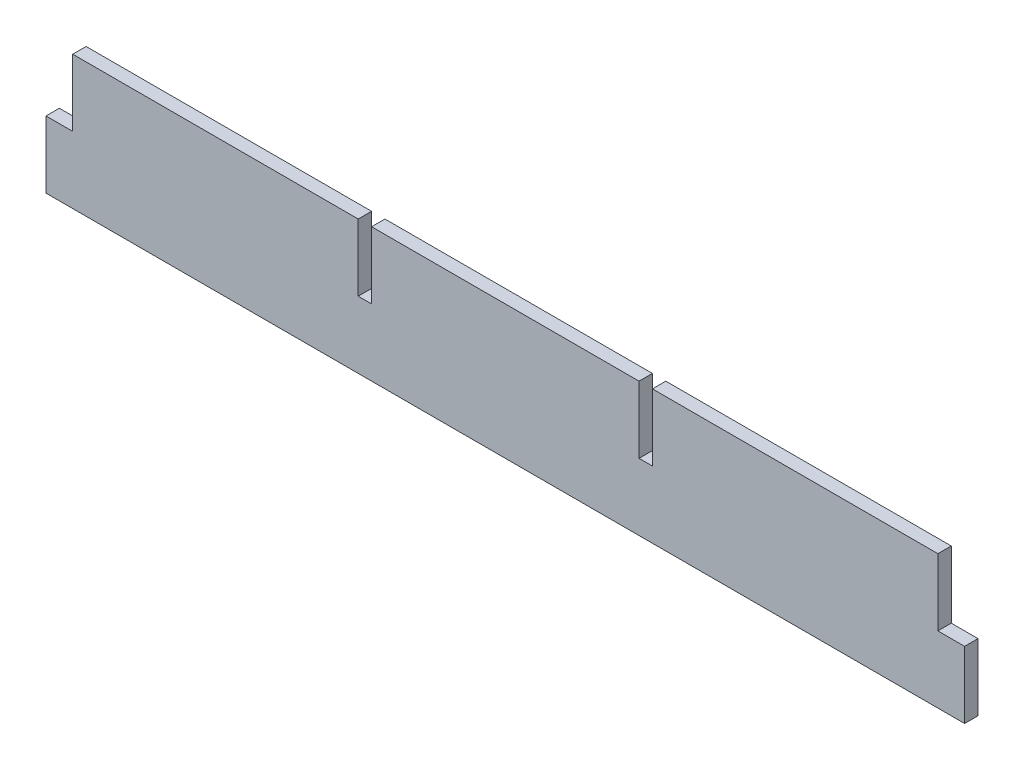
ISO-10303-21;
HEADER;
FILE_DESCRIPTION(('STEP AP214'),'2;1');
FILE_NAME('part.step','',(''),(''),'','','');
FILE_SCHEMA(('AUTOMOTIVE_DESIGN { 1 0 10303 214 1 1 1 1 }'));
ENDSEC;
DATA;
#1=APPLICATION_CONTEXT('core data for automotive mechanical design processes');
#2=APPLICATION_PROTOCOL_DEFINITION('international standard','automotive_design',2000,#1);
#3=PRODUCT_CONTEXT('',#1,'mechanical');
#4=PRODUCT('Part','Part','',(#3));
#5=PRODUCT_RELATED_PRODUCT_CATEGORY('part','',(#4));
#6=PRODUCT_DEFINITION_FORMATION('','',#4);
#7=PRODUCT_DEFINITION_CONTEXT('part definition',#1,'design');
#8=PRODUCT_DEFINITION('design','',#6,#7);
#9=PRODUCT_DEFINITION_SHAPE('','',#8);
#10=(LENGTH_UNIT() NAMED_UNIT(*) SI_UNIT(.MILLI.,.METRE.));
#11=(NAMED_UNIT(*) PLANE_ANGLE_UNIT() SI_UNIT($,.RADIAN.));
#12=(NAMED_UNIT(*) SI_UNIT($,.STERADIAN.) SOLID_ANGLE_UNIT());
#13=UNCERTAINTY_MEASURE_WITH_UNIT(LENGTH_MEASURE(1.E-05),#10,'distance_accuracy_value','');
#14=(GEOMETRIC_REPRESENTATION_CONTEXT(3) GLOBAL_UNCERTAINTY_ASSIGNED_CONTEXT((#13)) GLOBAL_UNIT_ASSIGNED_CONTEXT((#10,
#11,#12)) REPRESENTATION_CONTEXT('',''));
#15=CARTESIAN_POINT('',(0.,0.,0.));
#16=DIRECTION('',(0.,0.,1.));
#17=DIRECTION('',(1.,0.,0.));
#18=AXIS2_PLACEMENT_3D('',#15,#16,#17);
#19=CARTESIAN_POINT('',(323.475,0.,10.));
#20=DIRECTION('',(1.,0.,0.));
#21=DIRECTION('',(0.,0.,-1.));
#22=AXIS2_PLACEMENT_3D('',#19,#20,#21);
#23=PLANE('',#22);
#24=DIRECTION('',(0.,-1.,0.));
#25=VECTOR('',#24,1.);
#26=CARTESIAN_POINT('',(323.475,0.,0.));
#27=LINE('',#26,#25);
#28=CARTESIAN_POINT('',(323.475,-1.00613961606655E-13,0.));
#29=VERTEX_POINT('',#28);
#30=CARTESIAN_POINT('',(323.475,-50.0000000000001,0.));
#31=VERTEX_POINT('',#30);
#32=EDGE_CURVE('E328',#29,#31,#27,.T.);
#33=ORIENTED_EDGE('',*,*,#32,.F.);
#34=DIRECTION('',(0.,0.,-1.));
#35=VECTOR('',#34,1.);
#36=CARTESIAN_POINT('',(323.475,-1.00613961606655E-13,10.));
#37=LINE('',#36,#35);
#38=CARTESIAN_POINT('',(323.475,-1.00613961606655E-13,10.));
#39=VERTEX_POINT('',#38);
#40=EDGE_CURVE('E352',#39,#29,#37,.T.);
#41=ORIENTED_EDGE('',*,*,#40,.F.);
#42=DIRECTION('',(0.,-1.,0.));
#43=VECTOR('',#42,1.);
#44=CARTESIAN_POINT('',(323.475,0.,10.));
#45=LINE('',#44,#43);
#46=CARTESIAN_POINT('',(323.475,-50.0000000000001,10.));
#47=VERTEX_POINT('',#46);
#48=EDGE_CURVE('E439',#39,#47,#45,.T.);
#49=ORIENTED_EDGE('',*,*,#48,.T.);
#50=DIRECTION('',(0.,0.,-1.));
#51=VECTOR('',#50,1.);
#52=CARTESIAN_POINT('',(323.475,-50.0000000000001,10.));
#53=LINE('',#52,#51);
#54=EDGE_CURVE('E355',#47,#31,#53,.T.);
#55=ORIENTED_EDGE('',*,*,#54,.T.);
#56=EDGE_LOOP('',(#33,#41,#49,#55));
#57=FACE_BOUND('',#56,.T.);
#58=ADVANCED_FACE('F139',(#57),#23,.T.);
#59=CARTESIAN_POINT('',(0.,0.,0.));
#60=DIRECTION('',(0.,0.,1.));
#61=DIRECTION('',(1.,0.,0.));
#62=AXIS2_PLACEMENT_3D('',#59,#60,#61);
#63=PLANE('',#62);
#64=DIRECTION('',(1.,0.,0.));
#65=VECTOR('',#64,1.);
#66=CARTESIAN_POINT('',(0.,1.11022302462515E-13,0.));
#67=LINE('',#66,#65);
#68=CARTESIAN_POINT('',(-100.,0.,0.));
#69=VERTEX_POINT('',#68);
#70=CARTESIAN_POINT('',(100.,2.22044604925032E-13,0.));
#71=VERTEX_POINT('',#70);
#72=EDGE_CURVE('E287',#69,#71,#67,.T.);
#73=ORIENTED_EDGE('',*,*,#72,.T.);
#74=DIRECTION('',(0.,-1.,0.));
#75=VECTOR('',#74,1.);
#76=CARTESIAN_POINT('',(100.,2.22044604925032E-13,0.));
#77=LINE('',#76,#75);
#78=CARTESIAN_POINT('',(100.,-49.9999999999997,0.));
#79=VERTEX_POINT('',#78);
#80=EDGE_CURVE('E341',#71,#79,#77,.T.);
#81=ORIENTED_EDGE('',*,*,#80,.T.);
#82=DIRECTION('',(-1.,0.,0.));
#83=VECTOR('',#82,1.);
#84=CARTESIAN_POINT('',(1.38777878078145E-13,-50.,0.));
#85=LINE('',#84,#83);
#86=CARTESIAN_POINT('',(110.,-49.9999999999997,0.));
#87=VERTEX_POINT('',#86);
#88=EDGE_CURVE('E338',#87,#79,#85,.T.);
#89=ORIENTED_EDGE('',*,*,#88,.F.);
#90=DIRECTION('',(0.,-1.,0.));
#91=VECTOR('',#90,1.);
#92=CARTESIAN_POINT('',(110.,2.74780198594727E-13,0.));
#93=LINE('',#92,#91);
#94=CARTESIAN_POINT('',(110.,2.44249061447068E-13,0.));
#95=VERTEX_POINT('',#94);
#96=EDGE_CURVE('E273',#95,#87,#93,.T.);
#97=ORIENTED_EDGE('',*,*,#96,.F.);
#98=DIRECTION('',(1.,0.,0.));
#99=VECTOR('',#98,1.);
#100=CARTESIAN_POINT('',(0.,4.21951058497102E-13,0.));
#101=LINE('',#100,#99);
#102=EDGE_CURVE('E332',#95,#29,#101,.T.);
#103=ORIENTED_EDGE('',*,*,#102,.T.);
#104=ORIENTED_EDGE('',*,*,#32,.T.);
#105=DIRECTION('',(1.,0.,0.));
#106=VECTOR('',#105,1.);
#107=CARTESIAN_POINT('',(0.,-50.0000000000001,0.));
#108=LINE('',#107,#106);
#109=CARTESIAN_POINT('',(343.475,-50.0000000000001,0.));
#110=VERTEX_POINT('',#109);
#111=EDGE_CURVE('E324',#31,#110,#108,.T.);
#112=ORIENTED_EDGE('',*,*,#111,.T.);
#113=DIRECTION('',(0.,-1.,0.));
#114=VECTOR('',#113,1.);
#115=CARTESIAN_POINT('',(343.475,-3.81333853383126E-13,0.));
#116=LINE('',#115,#114);
#117=CARTESIAN_POINT('',(343.475,-100.,0.));
#118=VERTEX_POINT('',#117);
#119=EDGE_CURVE('E320',#110,#118,#116,.T.);
#120=ORIENTED_EDGE('',*,*,#119,.T.);
#121=DIRECTION('',(-1.,0.,0.));
#122=VECTOR('',#121,1.);
#123=CARTESIAN_POINT('',(0.,-100.,0.));
#124=LINE('',#123,#122);
#125=CARTESIAN_POINT('',(-343.475,-100.,0.));
#126=VERTEX_POINT('',#125);
#127=EDGE_CURVE('E316',#118,#126,#124,.T.);
#128=ORIENTED_EDGE('',*,*,#127,.T.);
#129=DIRECTION('',(0.,-1.,0.));
#130=VECTOR('',#129,1.);
#131=CARTESIAN_POINT('',(-343.475,0.,0.));
#132=LINE('',#131,#130);
#133=CARTESIAN_POINT('',(-343.475,-50.0000000000002,0.));
#134=VERTEX_POINT('',#133);
#135=EDGE_CURVE('E312',#134,#126,#132,.T.);
#136=ORIENTED_EDGE('',*,*,#135,.F.);
#137=DIRECTION('',(-1.,0.,0.));
#138=VECTOR('',#137,1.);
#139=CARTESIAN_POINT('',(6.24500451351599E-13,-49.9999999999959,0.));
#140=LINE('',#139,#138);
#141=CARTESIAN_POINT('',(-323.475,-50.,0.));
#142=VERTEX_POINT('',#141);
#143=EDGE_CURVE('E309',#142,#134,#140,.T.);
#144=ORIENTED_EDGE('',*,*,#143,.F.);
#145=DIRECTION('',(0.,-1.,0.));
#146=VECTOR('',#145,1.);
#147=CARTESIAN_POINT('',(-323.475,0.,0.));
#148=LINE('',#147,#146);
#149=CARTESIAN_POINT('',(-323.475,0.,0.));
#150=VERTEX_POINT('',#149);
#151=EDGE_CURVE('E306',#150,#142,#148,.T.);
#152=ORIENTED_EDGE('',*,*,#151,.F.);
#153=DIRECTION('',(1.,0.,0.));
#154=VECTOR('',#153,1.);
#155=CARTESIAN_POINT('',(0.,0.,0.));
#156=LINE('',#155,#154);
#157=CARTESIAN_POINT('',(-110.,0.,0.));
#158=VERTEX_POINT('',#157);
#159=EDGE_CURVE('E302',#150,#158,#156,.T.);
#160=ORIENTED_EDGE('',*,*,#159,.T.);
#161=DIRECTION('',(0.,-1.,0.));
#162=VECTOR('',#161,1.);
#163=CARTESIAN_POINT('',(-110.,0.,0.));
#164=LINE('',#163,#162);
#165=CARTESIAN_POINT('',(-110.,-50.,0.));
#166=VERTEX_POINT('',#165);
#167=EDGE_CURVE('E298',#158,#166,#164,.T.);
#168=ORIENTED_EDGE('',*,*,#167,.T.);
#169=DIRECTION('',(1.,0.,0.));
#170=VECTOR('',#169,1.);
#171=CARTESIAN_POINT('',(0.,-50.,0.));
#172=LINE('',#171,#170);
#173=CARTESIAN_POINT('',(-100.,-50.,0.));
#174=VERTEX_POINT('',#173);
#175=EDGE_CURVE('E294',#166,#174,#172,.T.);
#176=ORIENTED_EDGE('',*,*,#175,.T.);
#177=DIRECTION('',(0.,-1.,0.));
#178=VECTOR('',#177,1.);
#179=CARTESIAN_POINT('',(-100.,0.,0.));
#180=LINE('',#179,#178);
#181=EDGE_CURVE('E290',#69,#174,#180,.T.);
#182=ORIENTED_EDGE('',*,*,#181,.F.);
#183=EDGE_LOOP('',(#73,#81,#89,#97,#103,#104,#112,#120,#128,#136,#144,#152,#160,#168,#176,#182));
#184=FACE_BOUND('',#183,.T.);
#185=ADVANCED_FACE('F395',(#184),#63,.F.);
#186=CARTESIAN_POINT('',(0.,-50.0000000000001,10.));
#187=DIRECTION('',(0.,1.,0.));
#188=DIRECTION('',(0.,0.,1.));
#189=AXIS2_PLACEMENT_3D('',#186,#187,#188);
#190=PLANE('',#189);
#191=ORIENTED_EDGE('',*,*,#111,.F.);
#192=ORIENTED_EDGE('',*,*,#54,.F.);
#193=DIRECTION('',(1.,0.,0.));
#194=VECTOR('',#193,1.);
#195=CARTESIAN_POINT('',(0.,-50.0000000000001,10.));
#196=LINE('',#195,#194);
#197=CARTESIAN_POINT('',(343.475,-50.0000000000001,10.));
#198=VERTEX_POINT('',#197);
#199=EDGE_CURVE('E435',#47,#198,#196,.T.);
#200=ORIENTED_EDGE('',*,*,#199,.T.);
#201=DIRECTION('',(0.,0.,-1.));
#202=VECTOR('',#201,1.);
#203=CARTESIAN_POINT('',(343.475,-50.0000000000001,10.));
#204=LINE('',#203,#202);
#205=EDGE_CURVE('E358',#198,#110,#204,.T.);
#206=ORIENTED_EDGE('',*,*,#205,.T.);
#207=EDGE_LOOP('',(#191,#192,#200,#206));
#208=FACE_BOUND('',#207,.T.);
#209=ADVANCED_FACE('F457',(#208),#190,.T.);
#210=CARTESIAN_POINT('',(343.475,-3.81333853383126E-13,10.));
#211=DIRECTION('',(1.,0.,0.));
#212=DIRECTION('',(0.,1.,0.));
#213=AXIS2_PLACEMENT_3D('',#210,#211,#212);
#214=PLANE('',#213);
#215=ORIENTED_EDGE('',*,*,#119,.F.);
#216=ORIENTED_EDGE('',*,*,#205,.F.);
#217=DIRECTION('',(0.,-1.,0.));
#218=VECTOR('',#217,1.);
#219=CARTESIAN_POINT('',(343.475,-3.81333853383126E-13,10.));
#220=LINE('',#219,#218);
#221=CARTESIAN_POINT('',(343.475,-100.,10.));
#222=VERTEX_POINT('',#221);
#223=EDGE_CURVE('E431',#198,#222,#220,.T.);
#224=ORIENTED_EDGE('',*,*,#223,.T.);
#225=DIRECTION('',(0.,0.,-1.));
#226=VECTOR('',#225,1.);
#227=CARTESIAN_POINT('',(343.475,-100.,10.));
#228=LINE('',#227,#226);
#229=EDGE_CURVE('E361',#222,#118,#228,.T.);
#230=ORIENTED_EDGE('',*,*,#229,.T.);
#231=EDGE_LOOP('',(#215,#216,#224,#230));
#232=FACE_BOUND('',#231,.T.);
#233=ADVANCED_FACE('F462',(#232),#214,.T.);
#234=CARTESIAN_POINT('',(0.,-100.,10.));
#235=DIRECTION('',(0.,-1.,0.));
#236=DIRECTION('',(1.,0.,0.));
#237=AXIS2_PLACEMENT_3D('',#234,#235,#236);
#238=PLANE('',#237);
#239=ORIENTED_EDGE('',*,*,#127,.F.);
#240=ORIENTED_EDGE('',*,*,#229,.F.);
#241=DIRECTION('',(-1.,0.,0.));
#242=VECTOR('',#241,1.);
#243=CARTESIAN_POINT('',(0.,-100.,10.));
#244=LINE('',#243,#242);
#245=CARTESIAN_POINT('',(-343.475,-100.,10.));
#246=VERTEX_POINT('',#245);
#247=EDGE_CURVE('E427',#222,#246,#244,.T.);
#248=ORIENTED_EDGE('',*,*,#247,.T.);
#249=DIRECTION('',(0.,0.,-1.));
#250=VECTOR('',#249,1.);
#251=CARTESIAN_POINT('',(-343.475,-100.,10.));
#252=LINE('',#251,#250);
#253=EDGE_CURVE('E364',#246,#126,#252,.T.);
#254=ORIENTED_EDGE('',*,*,#253,.T.);
#255=EDGE_LOOP('',(#239,#240,#248,#254));
#256=FACE_BOUND('',#255,.T.);
#257=ADVANCED_FACE('F480',(#256),#238,.T.);
#258=CARTESIAN_POINT('',(-343.475,0.,10.));
#259=DIRECTION('',(1.,0.,0.));
#260=DIRECTION('',(0.,0.,-1.));
#261=AXIS2_PLACEMENT_3D('',#258,#259,#260);
#262=PLANE('',#261);
#263=ORIENTED_EDGE('',*,*,#135,.T.);
#264=ORIENTED_EDGE('',*,*,#253,.F.);
#265=DIRECTION('',(0.,-1.,0.));
#266=VECTOR('',#265,1.);
#267=CARTESIAN_POINT('',(-343.475,0.,10.));
#268=LINE('',#267,#266);
#269=CARTESIAN_POINT('',(-343.475,-50.0000000000002,10.));
#270=VERTEX_POINT('',#269);
#271=EDGE_CURVE('E424',#270,#246,#268,.T.);
#272=ORIENTED_EDGE('',*,*,#271,.F.);
#273=DIRECTION('',(0.,0.,-1.));
#274=VECTOR('',#273,1.);
#275=CARTESIAN_POINT('',(-343.475,-50.0000000000002,10.));
#276=LINE('',#275,#274);
#277=EDGE_CURVE('E367',#270,#134,#276,.T.);
#278=ORIENTED_EDGE('',*,*,#277,.T.);
#279=EDGE_LOOP('',(#263,#264,#272,#278));
#280=FACE_BOUND('',#279,.T.);
#281=ADVANCED_FACE('F484',(#280),#262,.F.);
#282=CARTESIAN_POINT('',(6.24500451351599E-13,-49.9999999999959,10.));
#283=DIRECTION('',(0.,-1.,0.));
#284=DIRECTION('',(1.,0.,0.));
#285=AXIS2_PLACEMENT_3D('',#282,#283,#284);
#286=PLANE('',#285);
#287=ORIENTED_EDGE('',*,*,#143,.T.);
#288=ORIENTED_EDGE('',*,*,#277,.F.);
#289=DIRECTION('',(-1.,0.,0.));
#290=VECTOR('',#289,1.);
#291=CARTESIAN_POINT('',(6.24500451351599E-13,-49.9999999999959,10.));
#292=LINE('',#291,#290);
#293=CARTESIAN_POINT('',(-323.475,-50.,10.));
#294=VERTEX_POINT('',#293);
#295=EDGE_CURVE('E421',#294,#270,#292,.T.);
#296=ORIENTED_EDGE('',*,*,#295,.F.);
#297=DIRECTION('',(0.,0.,-1.));
#298=VECTOR('',#297,1.);
#299=CARTESIAN_POINT('',(-323.475,-50.,10.));
#300=LINE('',#299,#298);
#301=EDGE_CURVE('E371',#294,#142,#300,.T.);
#302=ORIENTED_EDGE('',*,*,#301,.T.);
#303=EDGE_LOOP('',(#287,#288,#296,#302));
#304=FACE_BOUND('',#303,.T.);
#305=ADVANCED_FACE('F488',(#304),#286,.F.);
#306=CARTESIAN_POINT('',(-323.475,0.,10.));
#307=DIRECTION('',(1.,0.,0.));
#308=DIRECTION('',(0.,0.,-1.));
#309=AXIS2_PLACEMENT_3D('',#306,#307,#308);
#310=PLANE('',#309);
#311=ORIENTED_EDGE('',*,*,#151,.T.);
#312=ORIENTED_EDGE('',*,*,#301,.F.);
#313=DIRECTION('',(0.,-1.,0.));
#314=VECTOR('',#313,1.);
#315=CARTESIAN_POINT('',(-323.475,0.,10.));
#316=LINE('',#315,#314);
#317=CARTESIAN_POINT('',(-323.475,0.,10.));
#318=VERTEX_POINT('',#317);
#319=EDGE_CURVE('E418',#318,#294,#316,.T.);
#320=ORIENTED_EDGE('',*,*,#319,.F.);
#321=DIRECTION('',(0.,0.,-1.));
#322=VECTOR('',#321,1.);
#323=CARTESIAN_POINT('',(-323.475,0.,10.));
#324=LINE('',#323,#322);
#325=EDGE_CURVE('E375',#318,#150,#324,.T.);
#326=ORIENTED_EDGE('',*,*,#325,.T.);
#327=EDGE_LOOP('',(#311,#312,#320,#326));
#328=FACE_BOUND('',#327,.T.);
#329=ADVANCED_FACE('F492',(#328),#310,.F.);
#330=CARTESIAN_POINT('',(0.,0.,10.));
#331=DIRECTION('',(0.,1.,0.));
#332=DIRECTION('',(-1.,0.,0.));
#333=AXIS2_PLACEMENT_3D('',#330,#331,#332);
#334=PLANE('',#333);
#335=ORIENTED_EDGE('',*,*,#159,.F.);
#336=ORIENTED_EDGE('',*,*,#325,.F.);
#337=DIRECTION('',(1.,0.,0.));
#338=VECTOR('',#337,1.);
#339=CARTESIAN_POINT('',(0.,0.,10.));
#340=LINE('',#339,#338);
#341=CARTESIAN_POINT('',(-110.,0.,10.));
#342=VERTEX_POINT('',#341);
#343=EDGE_CURVE('E411',#318,#342,#340,.T.);
#344=ORIENTED_EDGE('',*,*,#343,.T.);
#345=DIRECTION('',(0.,0.,-1.));
#346=VECTOR('',#345,1.);
#347=CARTESIAN_POINT('',(-110.,0.,10.));
#348=LINE('',#347,#346);
#349=EDGE_CURVE('E378',#342,#158,#348,.T.);
#350=ORIENTED_EDGE('',*,*,#349,.T.);
#351=EDGE_LOOP('',(#335,#336,#344,#350));
#352=FACE_BOUND('',#351,.T.);
#353=ADVANCED_FACE('F496',(#352),#334,.T.);
#354=CARTESIAN_POINT('',(-110.,0.,10.));
#355=DIRECTION('',(1.,0.,0.));
#356=DIRECTION('',(0.,1.,0.));
#357=AXIS2_PLACEMENT_3D('',#354,#355,#356);
#358=PLANE('',#357);
#359=ORIENTED_EDGE('',*,*,#167,.F.);
#360=ORIENTED_EDGE('',*,*,#349,.F.);
#361=DIRECTION('',(0.,-1.,0.));
#362=VECTOR('',#361,1.);
#363=CARTESIAN_POINT('',(-110.,0.,10.));
#364=LINE('',#363,#362);
#365=CARTESIAN_POINT('',(-110.,-50.,10.));
#366=VERTEX_POINT('',#365);
#367=EDGE_CURVE('E403',#342,#366,#364,.T.);
#368=ORIENTED_EDGE('',*,*,#367,.T.);
#369=DIRECTION('',(0.,0.,-1.));
#370=VECTOR('',#369,1.);
#371=CARTESIAN_POINT('',(-110.,-50.,10.));
#372=LINE('',#371,#370);
#373=EDGE_CURVE('E381',#366,#166,#372,.T.);
#374=ORIENTED_EDGE('',*,*,#373,.T.);
#375=EDGE_LOOP('',(#359,#360,#368,#374));
#376=FACE_BOUND('',#375,.T.);
#377=ADVANCED_FACE('F400',(#376),#358,.T.);
#378=CARTESIAN_POINT('',(0.,-50.,10.));
#379=DIRECTION('',(0.,1.,0.));
#380=DIRECTION('',(0.,0.,1.));
#381=AXIS2_PLACEMENT_3D('',#378,#379,#380);
#382=PLANE('',#381);
#383=ORIENTED_EDGE('',*,*,#175,.F.);
#384=ORIENTED_EDGE('',*,*,#373,.F.);
#385=DIRECTION('',(1.,0.,0.));
#386=VECTOR('',#385,1.);
#387=CARTESIAN_POINT('',(0.,-50.,10.));
#388=LINE('',#387,#386);
#389=CARTESIAN_POINT('',(-100.,-50.,10.));
#390=VERTEX_POINT('',#389);
#391=EDGE_CURVE('E390',#366,#390,#388,.T.);
#392=ORIENTED_EDGE('',*,*,#391,.T.);
#393=DIRECTION('',(0.,0.,-1.));
#394=VECTOR('',#393,1.);
#395=CARTESIAN_POINT('',(-100.,-50.,10.));
#396=LINE('',#395,#394);
#397=EDGE_CURVE('E149',#390,#174,#396,.T.);
#398=ORIENTED_EDGE('',*,*,#397,.T.);
#399=EDGE_LOOP('',(#383,#384,#392,#398));
#400=FACE_BOUND('',#399,.T.);
#401=ADVANCED_FACE('F388',(#400),#382,.T.);
#402=CARTESIAN_POINT('',(-100.,0.,10.));
#403=DIRECTION('',(1.,0.,0.));
#404=DIRECTION('',(0.,0.,-1.));
#405=AXIS2_PLACEMENT_3D('',#402,#403,#404);
#406=PLANE('',#405);
#407=ORIENTED_EDGE('',*,*,#181,.T.);
#408=ORIENTED_EDGE('',*,*,#397,.F.);
#409=DIRECTION('',(0.,-1.,0.));
#410=VECTOR('',#409,1.);
#411=CARTESIAN_POINT('',(-100.,0.,10.));
#412=LINE('',#411,#410);
#413=CARTESIAN_POINT('',(-100.,0.,10.));
#414=VERTEX_POINT('',#413);
#415=EDGE_CURVE('E406',#414,#390,#412,.T.);
#416=ORIENTED_EDGE('',*,*,#415,.F.);
#417=DIRECTION('',(0.,0.,-1.));
#418=VECTOR('',#417,1.);
#419=CARTESIAN_POINT('',(-100.,0.,10.));
#420=LINE('',#419,#418);
#421=EDGE_CURVE('E12',#414,#69,#420,.T.);
#422=ORIENTED_EDGE('',*,*,#421,.T.);
#423=EDGE_LOOP('',(#407,#408,#416,#422));
#424=FACE_BOUND('',#423,.T.);
#425=ADVANCED_FACE('F393',(#424),#406,.F.);
#426=CARTESIAN_POINT('',(0.,1.11022302462515E-13,10.));
#427=DIRECTION('',(0.,1.,0.));
#428=DIRECTION('',(-1.,0.,0.));
#429=AXIS2_PLACEMENT_3D('',#426,#427,#428);
#430=PLANE('',#429);
#431=ORIENTED_EDGE('',*,*,#72,.F.);
#432=ORIENTED_EDGE('',*,*,#421,.F.);
#433=DIRECTION('',(1.,0.,0.));
#434=VECTOR('',#433,1.);
#435=CARTESIAN_POINT('',(0.,1.11022302462515E-13,10.));
#436=LINE('',#435,#434);
#437=CARTESIAN_POINT('',(100.,2.22044604925032E-13,10.));
#438=VERTEX_POINT('',#437);
#439=EDGE_CURVE('E345',#414,#438,#436,.T.);
#440=ORIENTED_EDGE('',*,*,#439,.T.);
#441=DIRECTION('',(0.,0.,-1.));
#442=VECTOR('',#441,1.);
#443=CARTESIAN_POINT('',(100.,2.22044604925032E-13,10.));
#444=LINE('',#443,#442);
#445=EDGE_CURVE('E157',#438,#71,#444,.T.);
#446=ORIENTED_EDGE('',*,*,#445,.T.);
#447=EDGE_LOOP('',(#431,#432,#440,#446));
#448=FACE_BOUND('',#447,.T.);
#449=ADVANCED_FACE('F141',(#448),#430,.T.);
#450=CARTESIAN_POINT('',(100.,2.22044604925032E-13,10.));
#451=DIRECTION('',(1.,0.,0.));
#452=DIRECTION('',(0.,1.,0.));
#453=AXIS2_PLACEMENT_3D('',#450,#451,#452);
#454=PLANE('',#453);
#455=ORIENTED_EDGE('',*,*,#80,.F.);
#456=ORIENTED_EDGE('',*,*,#445,.F.);
#457=DIRECTION('',(0.,-1.,0.));
#458=VECTOR('',#457,1.);
#459=CARTESIAN_POINT('',(100.,2.22044604925032E-13,10.));
#460=LINE('',#459,#458);
#461=CARTESIAN_POINT('',(100.,-49.9999999999997,10.));
#462=VERTEX_POINT('',#461);
#463=EDGE_CURVE('E281',#438,#462,#460,.T.);
#464=ORIENTED_EDGE('',*,*,#463,.T.);
#465=DIRECTION('',(0.,0.,-1.));
#466=VECTOR('',#465,1.);
#467=CARTESIAN_POINT('',(100.,-49.9999999999997,10.));
#468=LINE('',#467,#466);
#469=EDGE_CURVE('E207',#462,#79,#468,.T.);
#470=ORIENTED_EDGE('',*,*,#469,.T.);
#471=EDGE_LOOP('',(#455,#456,#464,#470));
#472=FACE_BOUND('',#471,.T.);
#473=ADVANCED_FACE('F447',(#472),#454,.T.);
#474=CARTESIAN_POINT('',(1.38777878078145E-13,-50.,10.));
#475=DIRECTION('',(0.,-1.,0.));
#476=DIRECTION('',(1.,0.,0.));
#477=AXIS2_PLACEMENT_3D('',#474,#475,#476);
#478=PLANE('',#477);
#479=ORIENTED_EDGE('',*,*,#88,.T.);
#480=ORIENTED_EDGE('',*,*,#469,.F.);
#481=DIRECTION('',(-1.,0.,0.));
#482=VECTOR('',#481,1.);
#483=CARTESIAN_POINT('',(1.38777878078145E-13,-50.,10.));
#484=LINE('',#483,#482);
#485=CARTESIAN_POINT('',(110.,-49.9999999999997,10.));
#486=VERTEX_POINT('',#485);
#487=EDGE_CURVE('E262',#486,#462,#484,.T.);
#488=ORIENTED_EDGE('',*,*,#487,.F.);
#489=DIRECTION('',(0.,0.,-1.));
#490=VECTOR('',#489,1.);
#491=CARTESIAN_POINT('',(110.,-49.9999999999997,10.));
#492=LINE('',#491,#490);
#493=EDGE_CURVE('E270',#486,#87,#492,.T.);
#494=ORIENTED_EDGE('',*,*,#493,.T.);
#495=EDGE_LOOP('',(#479,#480,#488,#494));
#496=FACE_BOUND('',#495,.T.);
#497=ADVANCED_FACE('F279',(#496),#478,.F.);
#498=CARTESIAN_POINT('',(110.,2.74780198594727E-13,10.));
#499=DIRECTION('',(1.,0.,0.));
#500=DIRECTION('',(0.,1.,0.));
#501=AXIS2_PLACEMENT_3D('',#498,#499,#500);
#502=PLANE('',#501);
#503=ORIENTED_EDGE('',*,*,#96,.T.);
#504=ORIENTED_EDGE('',*,*,#493,.F.);
#505=DIRECTION('',(0.,-1.,0.));
#506=VECTOR('',#505,1.);
#507=CARTESIAN_POINT('',(110.,2.74780198594727E-13,10.));
#508=LINE('',#507,#506);
#509=CARTESIAN_POINT('',(110.,2.44249061447068E-13,10.));
#510=VERTEX_POINT('',#509);
#511=EDGE_CURVE('E256',#510,#486,#508,.T.);
#512=ORIENTED_EDGE('',*,*,#511,.F.);
#513=DIRECTION('',(0.,0.,-1.));
#514=VECTOR('',#513,1.);
#515=CARTESIAN_POINT('',(110.,2.44249061447068E-13,10.));
#516=LINE('',#515,#514);
#517=EDGE_CURVE('E277',#510,#95,#516,.T.);
#518=ORIENTED_EDGE('',*,*,#517,.T.);
#519=EDGE_LOOP('',(#503,#504,#512,#518));
#520=FACE_BOUND('',#519,.T.);
#521=ADVANCED_FACE('F271',(#520),#502,.F.);
#522=CARTESIAN_POINT('',(0.,4.21951058497102E-13,10.));
#523=DIRECTION('',(0.,1.,0.));
#524=DIRECTION('',(-1.,0.,0.));
#525=AXIS2_PLACEMENT_3D('',#522,#523,#524);
#526=PLANE('',#525);
#527=ORIENTED_EDGE('',*,*,#102,.F.);
#528=ORIENTED_EDGE('',*,*,#517,.F.);
#529=DIRECTION('',(1.,0.,0.));
#530=VECTOR('',#529,1.);
#531=CARTESIAN_POINT('',(0.,4.21951058497102E-13,10.));
#532=LINE('',#531,#530);
#533=EDGE_CURVE('E265',#510,#39,#532,.T.);
#534=ORIENTED_EDGE('',*,*,#533,.T.);
#535=ORIENTED_EDGE('',*,*,#40,.T.);
#536=EDGE_LOOP('',(#527,#528,#534,#535));
#537=FACE_BOUND('',#536,.T.);
#538=ADVANCED_FACE('F445',(#537),#526,.T.);
#539=CARTESIAN_POINT('',(0.,0.,10.));
#540=DIRECTION('',(0.,0.,1.));
#541=DIRECTION('',(1.,0.,0.));
#542=AXIS2_PLACEMENT_3D('',#539,#540,#541);
#543=PLANE('',#542);
#544=ORIENTED_EDGE('',*,*,#439,.F.);
#545=ORIENTED_EDGE('',*,*,#415,.T.);
#546=ORIENTED_EDGE('',*,*,#391,.F.);
#547=ORIENTED_EDGE('',*,*,#367,.F.);
#548=ORIENTED_EDGE('',*,*,#343,.F.);
#549=ORIENTED_EDGE('',*,*,#319,.T.);
#550=ORIENTED_EDGE('',*,*,#295,.T.);
#551=ORIENTED_EDGE('',*,*,#271,.T.);
#552=ORIENTED_EDGE('',*,*,#247,.F.);
#553=ORIENTED_EDGE('',*,*,#223,.F.);
#554=ORIENTED_EDGE('',*,*,#199,.F.);
#555=ORIENTED_EDGE('',*,*,#48,.F.);
#556=ORIENTED_EDGE('',*,*,#533,.F.);
#557=ORIENTED_EDGE('',*,*,#511,.T.);
#558=ORIENTED_EDGE('',*,*,#487,.T.);
#559=ORIENTED_EDGE('',*,*,#463,.F.);
#560=EDGE_LOOP('',(#544,#545,#546,#547,#548,#549,#550,#551,#552,#553,#554,#555,#556,#557,#558,#559));
#561=FACE_BOUND('',#560,.T.);
#562=ADVANCED_FACE('F259',(#561),#543,.T.);
#563=CLOSED_SHELL('',(#58,#185,#209,#233,#257,#281,#305,#329,#353,#377,#401,#425,#449,#473,#497,
#521,#538,#562));
#564=MANIFOLD_SOLID_BREP('B2',#563);
#565=ADVANCED_BREP_SHAPE_REPRESENTATION('',(#18,#564),#14);
#566=SHAPE_DEFINITION_REPRESENTATION(#9,#565);
ENDSEC;
END-ISO-10303-21;
